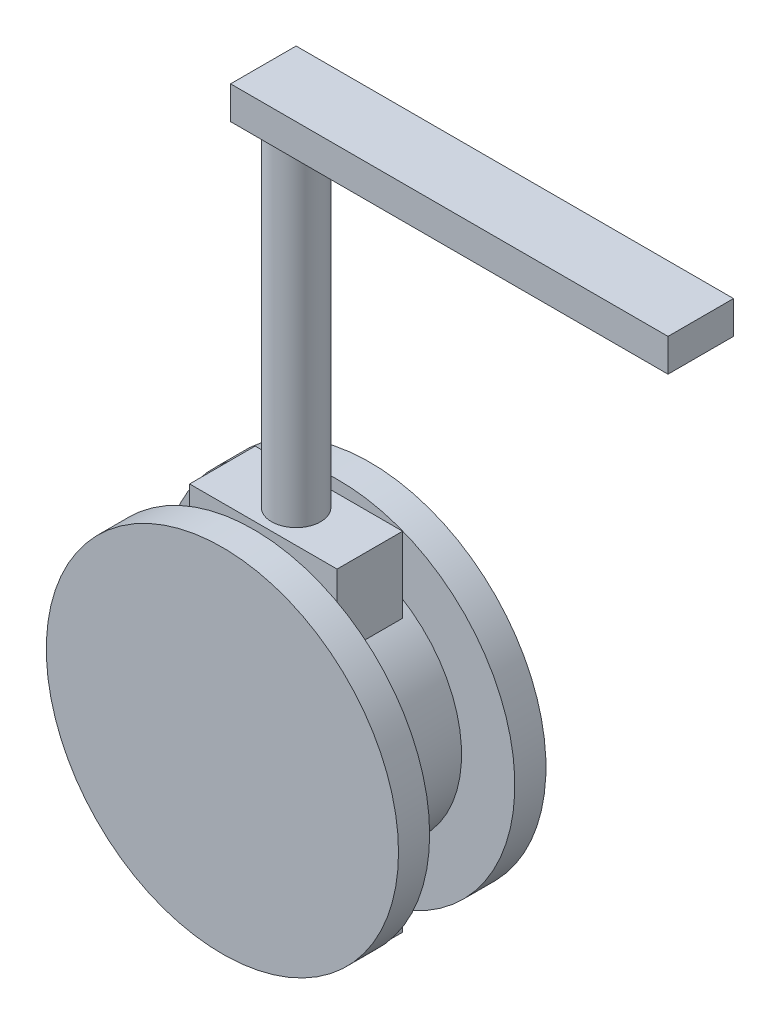
ISO-10303-21;
HEADER;
FILE_DESCRIPTION(('STEP AP214'),'2;1');
FILE_NAME('part.step','',(''),(''),'','','');
FILE_SCHEMA(('AUTOMOTIVE_DESIGN { 1 0 10303 214 1 1 1 1 }'));
ENDSEC;
DATA;
#1=APPLICATION_CONTEXT('core data for automotive mechanical design processes');
#2=APPLICATION_PROTOCOL_DEFINITION('international standard','automotive_design',2000,#1);
#3=PRODUCT_CONTEXT('',#1,'mechanical');
#4=PRODUCT('Part','Part','',(#3));
#5=PRODUCT_RELATED_PRODUCT_CATEGORY('part','',(#4));
#6=PRODUCT_DEFINITION_FORMATION('','',#4);
#7=PRODUCT_DEFINITION_CONTEXT('part definition',#1,'design');
#8=PRODUCT_DEFINITION('design','',#6,#7);
#9=PRODUCT_DEFINITION_SHAPE('','',#8);
#10=(LENGTH_UNIT() NAMED_UNIT(*) SI_UNIT(.MILLI.,.METRE.));
#11=(NAMED_UNIT(*) PLANE_ANGLE_UNIT() SI_UNIT($,.RADIAN.));
#12=(NAMED_UNIT(*) SI_UNIT($,.STERADIAN.) SOLID_ANGLE_UNIT());
#13=UNCERTAINTY_MEASURE_WITH_UNIT(LENGTH_MEASURE(1.E-05),#10,'distance_accuracy_value','');
#14=(GEOMETRIC_REPRESENTATION_CONTEXT(3) GLOBAL_UNCERTAINTY_ASSIGNED_CONTEXT((#13)) GLOBAL_UNIT_ASSIGNED_CONTEXT((#10,
#11,#12)) REPRESENTATION_CONTEXT('',''));
#15=CARTESIAN_POINT('',(0.,0.,0.));
#16=DIRECTION('',(0.,0.,1.));
#17=DIRECTION('',(1.,0.,0.));
#18=AXIS2_PLACEMENT_3D('',#15,#16,#17);
#19=CARTESIAN_POINT('',(0.,330.000000000009,0.));
#20=DIRECTION('',(0.,-1.00000000000001,0.));
#21=DIRECTION('',(0.,0.,-1.));
#22=AXIS2_PLACEMENT_3D('',#19,#20,#21);
#23=CYLINDRICAL_SURFACE('',#22,15.);
#24=CARTESIAN_POINT('',(0.,106.000000000002,1.55431223447522E-12));
#25=DIRECTION('',(0.,1.00000000000001,0.));
#26=DIRECTION('',(0.,0.,1.));
#27=AXIS2_PLACEMENT_3D('',#24,#25,#26);
#28=CIRCLE('',#27,15.);
#29=CARTESIAN_POINT('',(0.,106.000000000002,15.0000000000016));
#30=VERTEX_POINT('',#29);
#31=EDGE_CURVE('E140',#30,#30,#28,.T.);
#32=ORIENTED_EDGE('',*,*,#31,.T.);
#33=EDGE_LOOP('',(#32));
#34=FACE_BOUND('',#33,.T.);
#35=CARTESIAN_POINT('',(0.,310.000000000004,4.44089209850063E-13));
#36=DIRECTION('',(0.,-1.00000000000001,0.));
#37=DIRECTION('',(0.,0.,-1.));
#38=AXIS2_PLACEMENT_3D('',#35,#36,#37);
#39=CIRCLE('',#38,15.);
#40=CARTESIAN_POINT('',(0.,310.000000000004,-14.9999999999996));
#41=VERTEX_POINT('',#40);
#42=EDGE_CURVE('E175',#41,#41,#39,.T.);
#43=ORIENTED_EDGE('',*,*,#42,.T.);
#44=EDGE_LOOP('',(#43));
#45=FACE_BOUND('',#44,.T.);
#46=ADVANCED_FACE('F32',(#34,#45),#23,.T.);
#47=CARTESIAN_POINT('',(247.000000000002,310.000000000001,-20.0000000000017));
#48=DIRECTION('',(0.,-1.00000000000001,0.));
#49=DIRECTION('',(0.,0.,-1.));
#50=AXIS2_PLACEMENT_3D('',#47,#48,#49);
#51=PLANE('',#50);
#52=DIRECTION('',(0.,0.,-1.));
#53=VECTOR('',#52,1.);
#54=CARTESIAN_POINT('',(247.000000000002,310.000000000001,-20.0000000000017));
#55=LINE('',#54,#53);
#56=CARTESIAN_POINT('',(247.000000000002,310.000000000001,19.9999999999984));
#57=VERTEX_POINT('',#56);
#58=CARTESIAN_POINT('',(247.000000000002,310.000000000001,-20.0000000000017));
#59=VERTEX_POINT('',#58);
#60=EDGE_CURVE('E149',#57,#59,#55,.T.);
#61=ORIENTED_EDGE('',*,*,#60,.F.);
#62=DIRECTION('',(1.00000000000001,0.,0.));
#63=VECTOR('',#62,1.);
#64=CARTESIAN_POINT('',(247.000000000002,310.000000000001,19.9999999999984));
#65=LINE('',#64,#63);
#66=CARTESIAN_POINT('',(-19.9999999999996,310.000000000004,20.0000000000018));
#67=VERTEX_POINT('',#66);
#68=EDGE_CURVE('E159',#67,#57,#65,.T.);
#69=ORIENTED_EDGE('',*,*,#68,.F.);
#70=DIRECTION('',(0.,0.,1.));
#71=VECTOR('',#70,1.);
#72=CARTESIAN_POINT('',(-19.9999999999996,310.000000000004,-19.9999999999982));
#73=LINE('',#72,#71);
#74=CARTESIAN_POINT('',(-19.9999999999996,310.000000000004,-19.9999999999982));
#75=VERTEX_POINT('',#74);
#76=EDGE_CURVE('E156',#75,#67,#73,.T.);
#77=ORIENTED_EDGE('',*,*,#76,.F.);
#78=DIRECTION('',(-1.00000000000001,0.,0.));
#79=VECTOR('',#78,1.);
#80=CARTESIAN_POINT('',(247.000000000002,310.000000000001,-20.0000000000017));
#81=LINE('',#80,#79);
#82=EDGE_CURVE('E152',#59,#75,#81,.T.);
#83=ORIENTED_EDGE('',*,*,#82,.F.);
#84=EDGE_LOOP('',(#61,#69,#77,#83));
#85=FACE_BOUND('',#84,.T.);
#86=ORIENTED_EDGE('',*,*,#42,.F.);
#87=EDGE_LOOP('',(#86));
#88=FACE_BOUND('',#87,.T.);
#89=ADVANCED_FACE('F255',(#85,#88),#51,.T.);
#90=CARTESIAN_POINT('',(247.000000000002,310.000000000001,-20.0000000000017));
#91=DIRECTION('',(1.00000000000001,0.,0.));
#92=DIRECTION('',(0.,0.,-1.));
#93=AXIS2_PLACEMENT_3D('',#90,#91,#92);
#94=PLANE('',#93);
#95=DIRECTION('',(0.,0.,-1.));
#96=VECTOR('',#95,1.);
#97=CARTESIAN_POINT('',(247.000000000001,330.000000000009,-20.0000000000036));
#98=LINE('',#97,#96);
#99=CARTESIAN_POINT('',(247.000000000002,330.000000000009,19.9999999999965));
#100=VERTEX_POINT('',#99);
#101=CARTESIAN_POINT('',(247.000000000001,330.000000000009,-20.0000000000036));
#102=VERTEX_POINT('',#101);
#103=EDGE_CURVE('E144',#100,#102,#98,.T.);
#104=ORIENTED_EDGE('',*,*,#103,.F.);
#105=DIRECTION('',(0.,1.00000000000001,0.));
#106=VECTOR('',#105,1.);
#107=CARTESIAN_POINT('',(247.000000000002,310.000000000001,19.9999999999984));
#108=LINE('',#107,#106);
#109=EDGE_CURVE('E173',#57,#100,#108,.T.);
#110=ORIENTED_EDGE('',*,*,#109,.F.);
#111=ORIENTED_EDGE('',*,*,#60,.T.);
#112=DIRECTION('',(0.,1.00000000000001,0.));
#113=VECTOR('',#112,1.);
#114=CARTESIAN_POINT('',(247.000000000002,310.000000000001,-20.0000000000017));
#115=LINE('',#114,#113);
#116=EDGE_CURVE('E162',#59,#102,#115,.T.);
#117=ORIENTED_EDGE('',*,*,#116,.T.);
#118=EDGE_LOOP('',(#104,#110,#111,#117));
#119=FACE_BOUND('',#118,.T.);
#120=ADVANCED_FACE('F260',(#119),#94,.T.);
#121=CARTESIAN_POINT('',(247.000000000002,310.000000000001,19.9999999999984));
#122=DIRECTION('',(0.,0.,1.));
#123=DIRECTION('',(1.00000000000001,0.,0.));
#124=AXIS2_PLACEMENT_3D('',#121,#122,#123);
#125=PLANE('',#124);
#126=DIRECTION('',(1.00000000000001,0.,0.));
#127=VECTOR('',#126,1.);
#128=CARTESIAN_POINT('',(247.000000000002,330.000000000009,19.9999999999965));
#129=LINE('',#128,#127);
#130=CARTESIAN_POINT('',(-19.9999999999996,330.000000000009,20.));
#131=VERTEX_POINT('',#130);
#132=EDGE_CURVE('E153',#131,#100,#129,.T.);
#133=ORIENTED_EDGE('',*,*,#132,.F.);
#134=DIRECTION('',(0.,1.00000000000001,0.));
#135=VECTOR('',#134,1.);
#136=CARTESIAN_POINT('',(-19.9999999999996,310.000000000004,20.0000000000018));
#137=LINE('',#136,#135);
#138=EDGE_CURVE('E176',#67,#131,#137,.T.);
#139=ORIENTED_EDGE('',*,*,#138,.F.);
#140=ORIENTED_EDGE('',*,*,#68,.T.);
#141=ORIENTED_EDGE('',*,*,#109,.T.);
#142=EDGE_LOOP('',(#133,#139,#140,#141));
#143=FACE_BOUND('',#142,.T.);
#144=ADVANCED_FACE('F272',(#143),#125,.T.);
#145=CARTESIAN_POINT('',(-19.9999999999996,310.000000000004,-19.9999999999982));
#146=DIRECTION('',(-1.00000000000001,0.,0.));
#147=DIRECTION('',(0.,0.,1.));
#148=AXIS2_PLACEMENT_3D('',#145,#146,#147);
#149=PLANE('',#148);
#150=DIRECTION('',(0.,0.,1.));
#151=VECTOR('',#150,1.);
#152=CARTESIAN_POINT('',(-20.0000000000014,330.000000000009,-19.9999999999996));
#153=LINE('',#152,#151);
#154=CARTESIAN_POINT('',(-20.0000000000014,330.000000000009,-19.9999999999996));
#155=VERTEX_POINT('',#154);
#156=EDGE_CURVE('E168',#155,#131,#153,.T.);
#157=ORIENTED_EDGE('',*,*,#156,.F.);
#158=DIRECTION('',(0.,1.00000000000001,0.));
#159=VECTOR('',#158,1.);
#160=CARTESIAN_POINT('',(-19.9999999999996,310.000000000004,-19.9999999999982));
#161=LINE('',#160,#159);
#162=EDGE_CURVE('E178',#75,#155,#161,.T.);
#163=ORIENTED_EDGE('',*,*,#162,.F.);
#164=ORIENTED_EDGE('',*,*,#76,.T.);
#165=ORIENTED_EDGE('',*,*,#138,.T.);
#166=EDGE_LOOP('',(#157,#163,#164,#165));
#167=FACE_BOUND('',#166,.T.);
#168=ADVANCED_FACE('F276',(#167),#149,.T.);
#169=CARTESIAN_POINT('',(247.000000000002,310.000000000001,-20.0000000000017));
#170=DIRECTION('',(0.,0.,-1.));
#171=DIRECTION('',(-1.00000000000001,0.,0.));
#172=AXIS2_PLACEMENT_3D('',#169,#170,#171);
#173=PLANE('',#172);
#174=DIRECTION('',(-1.00000000000001,0.,0.));
#175=VECTOR('',#174,1.);
#176=CARTESIAN_POINT('',(247.000000000001,330.000000000009,-20.0000000000036));
#177=LINE('',#176,#175);
#178=EDGE_CURVE('E165',#102,#155,#177,.T.);
#179=ORIENTED_EDGE('',*,*,#178,.F.);
#180=ORIENTED_EDGE('',*,*,#116,.F.);
#181=ORIENTED_EDGE('',*,*,#82,.T.);
#182=ORIENTED_EDGE('',*,*,#162,.T.);
#183=EDGE_LOOP('',(#179,#180,#181,#182));
#184=FACE_BOUND('',#183,.T.);
#185=ADVANCED_FACE('F268',(#184),#173,.T.);
#186=CARTESIAN_POINT('',(0.,330.000000000009,0.));
#187=DIRECTION('',(0.,1.00000000000001,0.));
#188=DIRECTION('',(0.,0.,1.));
#189=AXIS2_PLACEMENT_3D('',#186,#187,#188);
#190=PLANE('',#189);
#191=ORIENTED_EDGE('',*,*,#103,.T.);
#192=ORIENTED_EDGE('',*,*,#178,.T.);
#193=ORIENTED_EDGE('',*,*,#156,.T.);
#194=ORIENTED_EDGE('',*,*,#132,.T.);
#195=EDGE_LOOP('',(#191,#192,#193,#194));
#196=FACE_BOUND('',#195,.T.);
#197=ADVANCED_FACE('F265',(#196),#190,.T.);
#198=CARTESIAN_POINT('',(-44.9999999999999,106.000000000005,20.000000000002));
#199=DIRECTION('',(0.,1.00000000000001,0.));
#200=DIRECTION('',(0.,0.,1.));
#201=AXIS2_PLACEMENT_3D('',#198,#199,#200);
#202=PLANE('',#201);
#203=DIRECTION('',(0.,0.,1.));
#204=VECTOR('',#203,1.);
#205=CARTESIAN_POINT('',(-44.9999999999999,106.000000000005,-19.999999999998));
#206=LINE('',#205,#204);
#207=CARTESIAN_POINT('',(-44.9999999999999,106.000000000005,-19.999999999998));
#208=VERTEX_POINT('',#207);
#209=CARTESIAN_POINT('',(-44.9999999999999,106.000000000005,20.000000000002));
#210=VERTEX_POINT('',#209);
#211=EDGE_CURVE('E127',#208,#210,#206,.T.);
#212=ORIENTED_EDGE('',*,*,#211,.T.);
#213=DIRECTION('',(1.00000000000001,0.,0.));
#214=VECTOR('',#213,1.);
#215=CARTESIAN_POINT('',(-44.9999999999999,106.000000000005,20.000000000002));
#216=LINE('',#215,#214);
#217=CARTESIAN_POINT('',(45.0000000000001,106.000000000002,20.0000000000011));
#218=VERTEX_POINT('',#217);
#219=EDGE_CURVE('E117',#210,#218,#216,.T.);
#220=ORIENTED_EDGE('',*,*,#219,.T.);
#221=DIRECTION('',(0.,0.,-1.));
#222=VECTOR('',#221,1.);
#223=CARTESIAN_POINT('',(45.0000000000001,106.000000000002,-19.9999999999971));
#224=LINE('',#223,#222);
#225=CARTESIAN_POINT('',(45.0000000000001,106.000000000002,-19.9999999999971));
#226=VERTEX_POINT('',#225);
#227=EDGE_CURVE('E126',#218,#226,#224,.T.);
#228=ORIENTED_EDGE('',*,*,#227,.T.);
#229=DIRECTION('',(-1.00000000000001,0.,0.));
#230=VECTOR('',#229,1.);
#231=CARTESIAN_POINT('',(-44.9999999999999,106.000000000005,-19.999999999998));
#232=LINE('',#231,#230);
#233=EDGE_CURVE('E133',#226,#208,#232,.T.);
#234=ORIENTED_EDGE('',*,*,#233,.T.);
#235=EDGE_LOOP('',(#212,#220,#228,#234));
#236=FACE_BOUND('',#235,.T.);
#237=ORIENTED_EDGE('',*,*,#31,.F.);
#238=EDGE_LOOP('',(#237));
#239=FACE_BOUND('',#238,.T.);
#240=ADVANCED_FACE('F130',(#236,#239),#202,.T.);
#241=CARTESIAN_POINT('',(-44.9999999999999,106.000000000005,-19.999999999998));
#242=DIRECTION('',(0.,0.,1.));
#243=DIRECTION('',(1.00000000000001,0.,0.));
#244=AXIS2_PLACEMENT_3D('',#241,#242,#243);
#245=PLANE('',#244);
#246=DIRECTION('',(0.,-1.00000000000001,0.));
#247=VECTOR('',#246,1.);
#248=CARTESIAN_POINT('',(45.0000000000001,106.000000000002,-19.9999999999971));
#249=LINE('',#248,#247);
#250=CARTESIAN_POINT('',(45.0000000000001,60.0000000000005,-19.999999999999));
#251=VERTEX_POINT('',#250);
#252=EDGE_CURVE('E205',#226,#251,#249,.T.);
#253=ORIENTED_EDGE('',*,*,#252,.T.);
#254=CARTESIAN_POINT('',(0.,0.,-20.));
#255=DIRECTION('',(0.,0.,1.));
#256=DIRECTION('',(1.00000000000001,0.,0.));
#257=AXIS2_PLACEMENT_3D('',#254,#255,#256);
#258=CIRCLE('',#257,75.);
#259=CARTESIAN_POINT('',(-44.9999999999999,60.0000000000023,-19.9999999999999));
#260=VERTEX_POINT('',#259);
#261=EDGE_CURVE('E190',#251,#260,#258,.T.);
#262=ORIENTED_EDGE('',*,*,#261,.T.);
#263=DIRECTION('',(0.,-1.00000000000001,0.));
#264=VECTOR('',#263,1.);
#265=CARTESIAN_POINT('',(-44.9999999999999,106.000000000005,-19.999999999998));
#266=LINE('',#265,#264);
#267=EDGE_CURVE('E204',#208,#260,#266,.T.);
#268=ORIENTED_EDGE('',*,*,#267,.F.);
#269=ORIENTED_EDGE('',*,*,#233,.F.);
#270=EDGE_LOOP('',(#253,#262,#268,#269));
#271=FACE_BOUND('',#270,.T.);
#272=ADVANCED_FACE('F203',(#271),#245,.F.);
#273=CARTESIAN_POINT('',(45.0000000000001,106.000000000002,-19.9999999999971));
#274=DIRECTION('',(-1.00000000000001,0.,0.));
#275=DIRECTION('',(0.,0.,1.));
#276=AXIS2_PLACEMENT_3D('',#273,#274,#275);
#277=PLANE('',#276);
#278=DIRECTION('',(0.,-1.00000000000001,0.));
#279=VECTOR('',#278,1.);
#280=CARTESIAN_POINT('',(45.0000000000001,106.000000000002,20.0000000000011));
#281=LINE('',#280,#279);
#282=CARTESIAN_POINT('',(45.0000000000001,60.0000000000076,20.000000000001));
#283=VERTEX_POINT('',#282);
#284=EDGE_CURVE('E123',#218,#283,#281,.T.);
#285=ORIENTED_EDGE('',*,*,#284,.T.);
#286=DIRECTION('',(0.,0.,-1.));
#287=VECTOR('',#286,1.);
#288=CARTESIAN_POINT('',(45.0000000000001,60.0000000000076,26.0000000000012));
#289=LINE('',#288,#287);
#290=EDGE_CURVE('E50',#283,#251,#289,.T.);
#291=ORIENTED_EDGE('',*,*,#290,.T.);
#292=ORIENTED_EDGE('',*,*,#252,.F.);
#293=ORIENTED_EDGE('',*,*,#227,.F.);
#294=EDGE_LOOP('',(#285,#291,#292,#293));
#295=FACE_BOUND('',#294,.T.);
#296=ADVANCED_FACE('F216',(#295),#277,.F.);
#297=CARTESIAN_POINT('',(-44.9999999999999,106.000000000005,20.000000000002));
#298=DIRECTION('',(0.,0.,-1.));
#299=DIRECTION('',(-1.00000000000001,0.,0.));
#300=AXIS2_PLACEMENT_3D('',#297,#298,#299);
#301=PLANE('',#300);
#302=DIRECTION('',(0.,-1.00000000000001,0.));
#303=VECTOR('',#302,1.);
#304=CARTESIAN_POINT('',(-44.9999999999999,106.000000000005,20.000000000002));
#305=LINE('',#304,#303);
#306=CARTESIAN_POINT('',(-44.9999999999999,60.0000000000058,20.0000000000019));
#307=VERTEX_POINT('',#306);
#308=EDGE_CURVE('E121',#210,#307,#305,.T.);
#309=ORIENTED_EDGE('',*,*,#308,.T.);
#310=CARTESIAN_POINT('',(0.,0.,20.));
#311=DIRECTION('',(0.,0.,-1.));
#312=DIRECTION('',(-1.00000000000001,0.,0.));
#313=AXIS2_PLACEMENT_3D('',#310,#311,#312);
#314=CIRCLE('',#313,75.);
#315=EDGE_CURVE('E40',#307,#283,#314,.T.);
#316=ORIENTED_EDGE('',*,*,#315,.T.);
#317=ORIENTED_EDGE('',*,*,#284,.F.);
#318=ORIENTED_EDGE('',*,*,#219,.F.);
#319=EDGE_LOOP('',(#309,#316,#317,#318));
#320=FACE_BOUND('',#319,.T.);
#321=ADVANCED_FACE('F119',(#320),#301,.F.);
#322=CARTESIAN_POINT('',(-44.9999999999999,106.000000000005,-19.999999999998));
#323=DIRECTION('',(1.00000000000001,0.,0.));
#324=DIRECTION('',(0.,0.,-1.));
#325=AXIS2_PLACEMENT_3D('',#322,#323,#324);
#326=PLANE('',#325);
#327=ORIENTED_EDGE('',*,*,#267,.T.);
#328=DIRECTION('',(0.,0.,-1.));
#329=VECTOR('',#328,1.);
#330=CARTESIAN_POINT('',(-44.9999999999999,60.0000000000058,26.0000000000021));
#331=LINE('',#330,#329);
#332=EDGE_CURVE('E11',#260,#307,#331,.F.);
#333=ORIENTED_EDGE('',*,*,#332,.T.);
#334=ORIENTED_EDGE('',*,*,#308,.F.);
#335=ORIENTED_EDGE('',*,*,#211,.F.);
#336=EDGE_LOOP('',(#327,#333,#334,#335));
#337=FACE_BOUND('',#336,.T.);
#338=ADVANCED_FACE('F139',(#337),#326,.F.);
#339=CARTESIAN_POINT('',(0.,0.,25.9999999999998));
#340=DIRECTION('',(0.,0.,-1.));
#341=DIRECTION('',(-1.00000000000001,0.,0.));
#342=AXIS2_PLACEMENT_3D('',#339,#340,#341);
#343=CYLINDRICAL_SURFACE('',#342,75.);
#344=DIRECTION('',(0.,0.,-1.));
#345=VECTOR('',#344,1.);
#346=CARTESIAN_POINT('',(-44.9999999999999,-59.9999999999987,26.0000000000002));
#347=LINE('',#346,#345);
#348=CARTESIAN_POINT('',(-44.9999999999999,-60.0000000000005,20.0000000000005));
#349=VERTEX_POINT('',#348);
#350=CARTESIAN_POINT('',(-44.9999999999999,-60.0000000000005,-20.0000000000009));
#351=VERTEX_POINT('',#350);
#352=EDGE_CURVE('E196',#349,#351,#347,.T.);
#353=ORIENTED_EDGE('',*,*,#352,.F.);
#354=CARTESIAN_POINT('',(44.9999999999999,-60.0000000000005,20.));
#355=VERTEX_POINT('',#354);
#356=EDGE_CURVE('E193',#355,#349,#314,.T.);
#357=ORIENTED_EDGE('',*,*,#356,.F.);
#358=DIRECTION('',(0.,0.,-1.));
#359=VECTOR('',#358,1.);
#360=CARTESIAN_POINT('',(44.9999999999999,-60.0000000000005,26.0000000000002));
#361=LINE('',#360,#359);
#362=CARTESIAN_POINT('',(44.9999999999999,-60.0000000000005,-19.9999999999987));
#363=VERTEX_POINT('',#362);
#364=EDGE_CURVE('E189',#363,#355,#361,.F.);
#365=ORIENTED_EDGE('',*,*,#364,.F.);
#366=EDGE_CURVE('E184',#351,#363,#258,.T.);
#367=ORIENTED_EDGE('',*,*,#366,.F.);
#368=EDGE_LOOP('',(#353,#357,#365,#367));
#369=FACE_BOUND('',#368,.T.);
#370=CARTESIAN_POINT('',(0.,0.,-25.9999999999998));
#371=DIRECTION('',(0.,0.,-1.));
#372=DIRECTION('',(-1.00000000000001,0.,0.));
#373=AXIS2_PLACEMENT_3D('',#370,#371,#372);
#374=CIRCLE('',#373,75.);
#375=CARTESIAN_POINT('',(-75.0000000000011,0.,-25.9999999999997));
#376=VERTEX_POINT('',#375);
#377=EDGE_CURVE('E436',#376,#376,#374,.T.);
#378=ORIENTED_EDGE('',*,*,#377,.F.);
#379=EDGE_LOOP('',(#378));
#380=FACE_BOUND('',#379,.T.);
#381=CARTESIAN_POINT('',(0.,0.,25.9999999999998));
#382=DIRECTION('',(0.,0.,1.));
#383=DIRECTION('',(1.00000000000001,0.,0.));
#384=AXIS2_PLACEMENT_3D('',#381,#382,#383);
#385=CIRCLE('',#384,75.);
#386=CARTESIAN_POINT('',(75.0000000000011,0.,25.9999999999997));
#387=VERTEX_POINT('',#386);
#388=EDGE_CURVE('E181',#387,#387,#385,.T.);
#389=ORIENTED_EDGE('',*,*,#388,.F.);
#390=EDGE_LOOP('',(#389));
#391=FACE_BOUND('',#390,.T.);
#392=ORIENTED_EDGE('',*,*,#332,.F.);
#393=ORIENTED_EDGE('',*,*,#261,.F.);
#394=ORIENTED_EDGE('',*,*,#290,.F.);
#395=ORIENTED_EDGE('',*,*,#315,.F.);
#396=EDGE_LOOP('',(#392,#393,#394,#395));
#397=FACE_BOUND('',#396,.T.);
#398=ADVANCED_FACE('F34',(#369,#380,#391,#397),#343,.T.);
#399=CARTESIAN_POINT('',(-44.9999999999999,-106.,20.0000000000018));
#400=VERTEX_POINT('',#399);
#401=EDGE_CURVE('E141',#349,#400,#305,.T.);
#402=ORIENTED_EDGE('',*,*,#401,.F.);
#403=ORIENTED_EDGE('',*,*,#352,.T.);
#404=CARTESIAN_POINT('',(-44.9999999999999,-106.,-19.9999999999987));
#405=VERTEX_POINT('',#404);
#406=EDGE_CURVE('E207',#351,#405,#266,.T.);
#407=ORIENTED_EDGE('',*,*,#406,.T.);
#408=DIRECTION('',(0.,0.,1.));
#409=VECTOR('',#408,1.);
#410=CARTESIAN_POINT('',(-44.9999999999999,-106.,-19.9999999999987));
#411=LINE('',#410,#409);
#412=EDGE_CURVE('E220',#405,#400,#411,.T.);
#413=ORIENTED_EDGE('',*,*,#412,.T.);
#414=EDGE_LOOP('',(#402,#403,#407,#413));
#415=FACE_BOUND('',#414,.T.);
#416=ADVANCED_FACE('F239',(#415),#326,.F.);
#417=CARTESIAN_POINT('',(45.0000000000001,-106.000000000003,20.0000000000009));
#418=VERTEX_POINT('',#417);
#419=EDGE_CURVE('E211',#355,#418,#281,.T.);
#420=ORIENTED_EDGE('',*,*,#419,.F.);
#421=ORIENTED_EDGE('',*,*,#356,.T.);
#422=ORIENTED_EDGE('',*,*,#401,.T.);
#423=DIRECTION('',(1.00000000000001,0.,0.));
#424=VECTOR('',#423,1.);
#425=CARTESIAN_POINT('',(-44.9999999999999,-106.,20.0000000000018));
#426=LINE('',#425,#424);
#427=EDGE_CURVE('E223',#400,#418,#426,.T.);
#428=ORIENTED_EDGE('',*,*,#427,.T.);
#429=EDGE_LOOP('',(#420,#421,#422,#428));
#430=FACE_BOUND('',#429,.T.);
#431=ADVANCED_FACE('F243',(#430),#301,.F.);
#432=CARTESIAN_POINT('',(45.0000000000001,-106.000000000003,-19.9999999999974));
#433=VERTEX_POINT('',#432);
#434=EDGE_CURVE('E206',#363,#433,#249,.T.);
#435=ORIENTED_EDGE('',*,*,#434,.F.);
#436=ORIENTED_EDGE('',*,*,#364,.T.);
#437=ORIENTED_EDGE('',*,*,#419,.T.);
#438=DIRECTION('',(0.,0.,-1.));
#439=VECTOR('',#438,1.);
#440=CARTESIAN_POINT('',(45.0000000000001,-106.000000000003,-19.9999999999974));
#441=LINE('',#440,#439);
#442=EDGE_CURVE('E225',#418,#433,#441,.T.);
#443=ORIENTED_EDGE('',*,*,#442,.T.);
#444=EDGE_LOOP('',(#435,#436,#437,#443));
#445=FACE_BOUND('',#444,.T.);
#446=ADVANCED_FACE('F245',(#445),#277,.F.);
#447=ORIENTED_EDGE('',*,*,#406,.F.);
#448=ORIENTED_EDGE('',*,*,#366,.T.);
#449=ORIENTED_EDGE('',*,*,#434,.T.);
#450=DIRECTION('',(-1.00000000000001,0.,0.));
#451=VECTOR('',#450,1.);
#452=CARTESIAN_POINT('',(-44.9999999999999,-106.,-19.9999999999987));
#453=LINE('',#452,#451);
#454=EDGE_CURVE('E137',#433,#405,#453,.T.);
#455=ORIENTED_EDGE('',*,*,#454,.T.);
#456=EDGE_LOOP('',(#447,#448,#449,#455));
#457=FACE_BOUND('',#456,.T.);
#458=ADVANCED_FACE('F233',(#457),#245,.F.);
#459=CARTESIAN_POINT('',(-44.9999999999999,-106.,20.0000000000018));
#460=DIRECTION('',(0.,1.00000000000001,0.));
#461=DIRECTION('',(0.,0.,1.));
#462=AXIS2_PLACEMENT_3D('',#459,#460,#461);
#463=PLANE('',#462);
#464=ORIENTED_EDGE('',*,*,#412,.F.);
#465=ORIENTED_EDGE('',*,*,#454,.F.);
#466=ORIENTED_EDGE('',*,*,#442,.F.);
#467=ORIENTED_EDGE('',*,*,#427,.F.);
#468=EDGE_LOOP('',(#464,#465,#466,#467));
#469=FACE_BOUND('',#468,.T.);
#470=ADVANCED_FACE('F236',(#469),#463,.F.);
#471=CARTESIAN_POINT('',(0.,0.,25.9999999999998));
#472=DIRECTION('',(0.,0.,1.));
#473=DIRECTION('',(1.00000000000001,0.,0.));
#474=AXIS2_PLACEMENT_3D('',#471,#472,#473);
#475=PLANE('',#474);
#476=CARTESIAN_POINT('',(0.,0.,25.9999999999998));
#477=DIRECTION('',(0.,0.,1.));
#478=DIRECTION('',(1.00000000000001,0.,0.));
#479=AXIS2_PLACEMENT_3D('',#476,#477,#478);
#480=CIRCLE('',#479,107.5);
#481=CARTESIAN_POINT('',(107.500000000002,0.,25.9999999999997));
#482=VERTEX_POINT('',#481);
#483=EDGE_CURVE('E440',#482,#482,#480,.T.);
#484=ORIENTED_EDGE('',*,*,#483,.F.);
#485=EDGE_LOOP('',(#484));
#486=FACE_BOUND('',#485,.T.);
#487=ORIENTED_EDGE('',*,*,#388,.T.);
#488=EDGE_LOOP('',(#487));
#489=FACE_BOUND('',#488,.T.);
#490=ADVANCED_FACE('F370',(#486,#489),#475,.F.);
#491=CARTESIAN_POINT('',(0.,0.,44.9999999999999));
#492=DIRECTION('',(0.,0.,-1.));
#493=DIRECTION('',(-1.00000000000001,0.,0.));
#494=AXIS2_PLACEMENT_3D('',#491,#492,#493);
#495=CYLINDRICAL_SURFACE('',#494,107.5);
#496=CARTESIAN_POINT('',(0.,0.,44.9999999999999));
#497=DIRECTION('',(0.,0.,1.));
#498=DIRECTION('',(1.00000000000001,0.,0.));
#499=AXIS2_PLACEMENT_3D('',#496,#497,#498);
#500=CIRCLE('',#499,107.5);
#501=CARTESIAN_POINT('',(107.500000000002,0.,44.9999999999998));
#502=VERTEX_POINT('',#501);
#503=EDGE_CURVE('E224',#502,#502,#500,.T.);
#504=ORIENTED_EDGE('',*,*,#503,.F.);
#505=EDGE_LOOP('',(#504));
#506=FACE_BOUND('',#505,.T.);
#507=ORIENTED_EDGE('',*,*,#483,.T.);
#508=EDGE_LOOP('',(#507));
#509=FACE_BOUND('',#508,.T.);
#510=ADVANCED_FACE('F379',(#506,#509),#495,.T.);
#511=CARTESIAN_POINT('',(0.,0.,44.9999999999999));
#512=DIRECTION('',(0.,0.,1.));
#513=DIRECTION('',(1.00000000000001,0.,0.));
#514=AXIS2_PLACEMENT_3D('',#511,#512,#513);
#515=PLANE('',#514);
#516=ORIENTED_EDGE('',*,*,#503,.T.);
#517=EDGE_LOOP('',(#516));
#518=FACE_BOUND('',#517,.T.);
#519=ADVANCED_FACE('F389',(#518),#515,.T.);
#520=CARTESIAN_POINT('',(0.,0.,-25.9999999999998));
#521=DIRECTION('',(0.,0.,-1.));
#522=DIRECTION('',(-1.00000000000001,0.,0.));
#523=AXIS2_PLACEMENT_3D('',#520,#521,#522);
#524=PLANE('',#523);
#525=CARTESIAN_POINT('',(0.,0.,-25.9999999999998));
#526=DIRECTION('',(0.,0.,-1.));
#527=DIRECTION('',(-1.00000000000001,0.,0.));
#528=AXIS2_PLACEMENT_3D('',#525,#526,#527);
#529=CIRCLE('',#528,107.5);
#530=CARTESIAN_POINT('',(-107.500000000002,0.,-25.9999999999997));
#531=VERTEX_POINT('',#530);
#532=EDGE_CURVE('E437',#531,#531,#529,.T.);
#533=ORIENTED_EDGE('',*,*,#532,.F.);
#534=EDGE_LOOP('',(#533));
#535=FACE_BOUND('',#534,.T.);
#536=ORIENTED_EDGE('',*,*,#377,.T.);
#537=EDGE_LOOP('',(#536));
#538=FACE_BOUND('',#537,.T.);
#539=ADVANCED_FACE('F399',(#535,#538),#524,.F.);
#540=CARTESIAN_POINT('',(0.,7.105427357601E-12,-44.9999999999999));
#541=DIRECTION('',(0.,0.,1.));
#542=DIRECTION('',(1.00000000000001,0.,0.));
#543=AXIS2_PLACEMENT_3D('',#540,#541,#542);
#544=CYLINDRICAL_SURFACE('',#543,107.5);
#545=CARTESIAN_POINT('',(0.,7.105427357601E-12,-44.9999999999999));
#546=DIRECTION('',(0.,0.,-1.));
#547=DIRECTION('',(-1.00000000000001,0.,0.));
#548=AXIS2_PLACEMENT_3D('',#545,#546,#547);
#549=CIRCLE('',#548,107.5);
#550=CARTESIAN_POINT('',(-107.500000000002,7.09945990884364E-12,-44.9999999999998));
#551=VERTEX_POINT('',#550);
#552=EDGE_CURVE('E435',#551,#551,#549,.T.);
#553=ORIENTED_EDGE('',*,*,#552,.F.);
#554=EDGE_LOOP('',(#553));
#555=FACE_BOUND('',#554,.T.);
#556=ORIENTED_EDGE('',*,*,#532,.T.);
#557=EDGE_LOOP('',(#556));
#558=FACE_BOUND('',#557,.T.);
#559=ADVANCED_FACE('F409',(#555,#558),#544,.T.);
#560=CARTESIAN_POINT('',(0.,7.105427357601E-12,-44.9999999999999));
#561=DIRECTION('',(0.,0.,-1.));
#562=DIRECTION('',(-1.00000000000001,0.,0.));
#563=AXIS2_PLACEMENT_3D('',#560,#561,#562);
#564=PLANE('',#563);
#565=ORIENTED_EDGE('',*,*,#552,.T.);
#566=EDGE_LOOP('',(#565));
#567=FACE_BOUND('',#566,.T.);
#568=ADVANCED_FACE('F419',(#567),#564,.T.);
#569=CLOSED_SHELL('',(#46,#89,#120,#144,#168,#185,#197,#240,#272,#296,#321,#338,#398,#416,#431,
#446,#458,#470,#490,#510,#519,#539,#559,#568));
#570=MANIFOLD_SOLID_BREP('B2',#569);
#571=ADVANCED_BREP_SHAPE_REPRESENTATION('',(#18,#570),#14);
#572=SHAPE_DEFINITION_REPRESENTATION(#9,#571);
ENDSEC;
END-ISO-10303-21;
